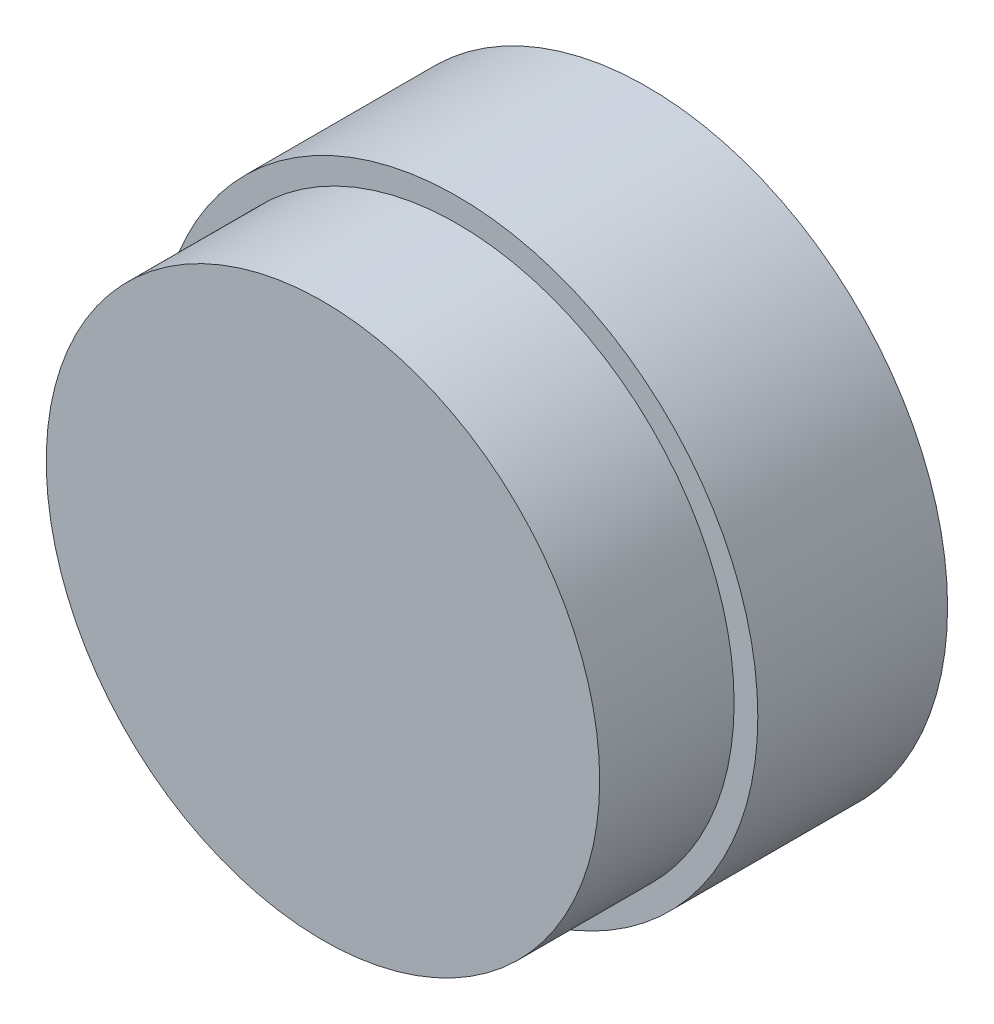
ISO-10303-21;
HEADER;
FILE_DESCRIPTION(('STEP AP214'),'2;1');
FILE_NAME('part.step','',(''),(''),'','','');
FILE_SCHEMA(('AUTOMOTIVE_DESIGN { 1 0 10303 214 1 1 1 1 }'));
ENDSEC;
DATA;
#1=APPLICATION_CONTEXT('core data for automotive mechanical design processes');
#2=APPLICATION_PROTOCOL_DEFINITION('international standard','automotive_design',2000,#1);
#3=PRODUCT_CONTEXT('',#1,'mechanical');
#4=PRODUCT('Part','Part','',(#3));
#5=PRODUCT_RELATED_PRODUCT_CATEGORY('part','',(#4));
#6=PRODUCT_DEFINITION_FORMATION('','',#4);
#7=PRODUCT_DEFINITION_CONTEXT('part definition',#1,'design');
#8=PRODUCT_DEFINITION('design','',#6,#7);
#9=PRODUCT_DEFINITION_SHAPE('','',#8);
#10=(LENGTH_UNIT() NAMED_UNIT(*) SI_UNIT(.MILLI.,.METRE.));
#11=(NAMED_UNIT(*) PLANE_ANGLE_UNIT() SI_UNIT($,.RADIAN.));
#12=(NAMED_UNIT(*) SI_UNIT($,.STERADIAN.) SOLID_ANGLE_UNIT());
#13=UNCERTAINTY_MEASURE_WITH_UNIT(LENGTH_MEASURE(1.E-05),#10,'distance_accuracy_value','');
#14=(GEOMETRIC_REPRESENTATION_CONTEXT(3) GLOBAL_UNCERTAINTY_ASSIGNED_CONTEXT((#13)) GLOBAL_UNIT_ASSIGNED_CONTEXT((#10,
#11,#12)) REPRESENTATION_CONTEXT('',''));
#15=CARTESIAN_POINT('',(0.,0.,0.));
#16=DIRECTION('',(0.,0.,1.));
#17=DIRECTION('',(1.,0.,0.));
#18=AXIS2_PLACEMENT_3D('',#15,#16,#17);
#19=CARTESIAN_POINT('',(17.677669529664,17.677669529664,11.99));
#20=DIRECTION('',(0.,0.,1.));
#21=DIRECTION('',(1.,0.,0.));
#22=AXIS2_PLACEMENT_3D('',#19,#20,#21);
#23=PLANE('',#22);
#24=CARTESIAN_POINT('',(17.677669529664,17.677669529664,11.99));
#25=DIRECTION('',(0.,0.,1.));
#26=DIRECTION('',(1.,0.,0.));
#27=AXIS2_PLACEMENT_3D('',#24,#25,#26);
#28=CIRCLE('',#27,1.);
#29=CARTESIAN_POINT('',(18.677669529664,17.677669529664,11.99));
#30=VERTEX_POINT('',#29);
#31=EDGE_CURVE('E9',#30,#30,#28,.T.);
#32=ORIENTED_EDGE('',*,*,#31,.F.);
#33=EDGE_LOOP('',(#32));
#34=FACE_BOUND('',#33,.T.);
#35=ADVANCED_FACE('F14',(#34),#23,.F.);
#36=CARTESIAN_POINT('',(-17.67766952966,17.677669529664,11.99));
#37=DIRECTION('',(0.,0.,1.));
#38=DIRECTION('',(1.,0.,0.));
#39=AXIS2_PLACEMENT_3D('',#36,#37,#38);
#40=PLANE('',#39);
#41=CARTESIAN_POINT('',(-17.67766952966,17.677669529664,11.99));
#42=DIRECTION('',(0.,0.,1.));
#43=DIRECTION('',(1.,0.,0.));
#44=AXIS2_PLACEMENT_3D('',#41,#42,#43);
#45=CIRCLE('',#44,1.);
#46=CARTESIAN_POINT('',(-16.67766952966,17.677669529664,11.99));
#47=VERTEX_POINT('',#46);
#48=EDGE_CURVE('E47',#47,#47,#45,.T.);
#49=ORIENTED_EDGE('',*,*,#48,.F.);
#50=EDGE_LOOP('',(#49));
#51=FACE_BOUND('',#50,.T.);
#52=ADVANCED_FACE('F164',(#51),#40,.F.);
#53=CARTESIAN_POINT('',(17.677669529664,-17.67766952966,11.99));
#54=DIRECTION('',(0.,0.,1.));
#55=DIRECTION('',(1.,0.,0.));
#56=AXIS2_PLACEMENT_3D('',#53,#54,#55);
#57=PLANE('',#56);
#58=CARTESIAN_POINT('',(17.677669529664,-17.67766952966,11.99));
#59=DIRECTION('',(0.,0.,1.));
#60=DIRECTION('',(1.,0.,0.));
#61=AXIS2_PLACEMENT_3D('',#58,#59,#60);
#62=CIRCLE('',#61,1.);
#63=CARTESIAN_POINT('',(18.677669529664,-17.67766952966,11.99));
#64=VERTEX_POINT('',#63);
#65=EDGE_CURVE('E118',#64,#64,#62,.T.);
#66=ORIENTED_EDGE('',*,*,#65,.F.);
#67=EDGE_LOOP('',(#66));
#68=FACE_BOUND('',#67,.T.);
#69=ADVANCED_FACE('F170',(#68),#57,.F.);
#70=CARTESIAN_POINT('',(-17.67766952966,-17.67766952966,11.99));
#71=DIRECTION('',(0.,0.,1.));
#72=DIRECTION('',(1.,0.,0.));
#73=AXIS2_PLACEMENT_3D('',#70,#71,#72);
#74=PLANE('',#73);
#75=CARTESIAN_POINT('',(-17.67766952966,-17.67766952966,11.99));
#76=DIRECTION('',(0.,0.,1.));
#77=DIRECTION('',(1.,0.,0.));
#78=AXIS2_PLACEMENT_3D('',#75,#76,#77);
#79=CIRCLE('',#78,1.);
#80=CARTESIAN_POINT('',(-16.67766952966,-17.67766952966,11.99));
#81=VERTEX_POINT('',#80);
#82=EDGE_CURVE('E112',#81,#81,#79,.T.);
#83=ORIENTED_EDGE('',*,*,#82,.F.);
#84=EDGE_LOOP('',(#83));
#85=FACE_BOUND('',#84,.T.);
#86=ADVANCED_FACE('F178',(#85),#74,.F.);
#87=CARTESIAN_POINT('',(0.,0.,41.));
#88=DIRECTION('',(0.,0.,1.));
#89=DIRECTION('',(1.,0.,0.));
#90=AXIS2_PLACEMENT_3D('',#87,#88,#89);
#91=PLANE('',#90);
#92=CARTESIAN_POINT('',(0.,0.,41.));
#93=DIRECTION('',(0.,0.,1.));
#94=DIRECTION('',(1.,0.,0.));
#95=AXIS2_PLACEMENT_3D('',#92,#93,#94);
#96=CIRCLE('',#95,35.);
#97=CARTESIAN_POINT('',(35.,0.,41.));
#98=VERTEX_POINT('',#97);
#99=EDGE_CURVE('E104',#98,#98,#96,.T.);
#100=ORIENTED_EDGE('',*,*,#99,.T.);
#101=EDGE_LOOP('',(#100));
#102=FACE_BOUND('',#101,.T.);
#103=ADVANCED_FACE('F16',(#102),#91,.T.);
#104=CARTESIAN_POINT('',(17.677669529664,17.677669529664,-0.01));
#105=DIRECTION('',(0.,0.,1.));
#106=DIRECTION('',(1.,0.,0.));
#107=AXIS2_PLACEMENT_3D('',#104,#105,#106);
#108=CYLINDRICAL_SURFACE('',#107,1.);
#109=CARTESIAN_POINT('',(17.677669529664,17.677669529664,0.));
#110=DIRECTION('',(0.,0.,1.));
#111=DIRECTION('',(1.,0.,0.));
#112=AXIS2_PLACEMENT_3D('',#109,#110,#111);
#113=CIRCLE('',#112,1.);
#114=CARTESIAN_POINT('',(18.677669529664,17.677669529664,0.));
#115=VERTEX_POINT('',#114);
#116=EDGE_CURVE('E131',#115,#115,#113,.T.);
#117=ORIENTED_EDGE('',*,*,#116,.F.);
#118=DIRECTION('',(0.,0.,1.));
#119=VECTOR('',#118,1.);
#120=CARTESIAN_POINT('',(18.677669529664,17.677669529664,-0.01));
#121=LINE('',#120,#119);
#122=EDGE_CURVE('E24',#115,#30,#121,.T.);
#123=ORIENTED_EDGE('',*,*,#122,.T.);
#124=ORIENTED_EDGE('',*,*,#31,.T.);
#125=ORIENTED_EDGE('',*,*,#122,.F.);
#126=EDGE_LOOP('',(#117,#123,#124,#125));
#127=FACE_BOUND('',#126,.T.);
#128=ADVANCED_FACE('F174',(#127),#108,.F.);
#129=CARTESIAN_POINT('',(-17.67766952966,17.677669529664,-0.01));
#130=DIRECTION('',(0.,0.,1.));
#131=DIRECTION('',(1.,0.,0.));
#132=AXIS2_PLACEMENT_3D('',#129,#130,#131);
#133=CYLINDRICAL_SURFACE('',#132,1.);
#134=CARTESIAN_POINT('',(-17.67766952966,17.677669529664,0.));
#135=DIRECTION('',(0.,0.,1.));
#136=DIRECTION('',(1.,0.,0.));
#137=AXIS2_PLACEMENT_3D('',#134,#135,#136);
#138=CIRCLE('',#137,1.);
#139=CARTESIAN_POINT('',(-16.67766952966,17.677669529664,0.));
#140=VERTEX_POINT('',#139);
#141=EDGE_CURVE('E128',#140,#140,#138,.T.);
#142=ORIENTED_EDGE('',*,*,#141,.F.);
#143=DIRECTION('',(0.,0.,1.));
#144=VECTOR('',#143,1.);
#145=CARTESIAN_POINT('',(-16.67766952966,17.677669529664,-0.01));
#146=LINE('',#145,#144);
#147=EDGE_CURVE('E115',#140,#47,#146,.T.);
#148=ORIENTED_EDGE('',*,*,#147,.T.);
#149=ORIENTED_EDGE('',*,*,#48,.T.);
#150=ORIENTED_EDGE('',*,*,#147,.F.);
#151=EDGE_LOOP('',(#142,#148,#149,#150));
#152=FACE_BOUND('',#151,.T.);
#153=ADVANCED_FACE('F177',(#152),#133,.F.);
#154=CARTESIAN_POINT('',(17.677669529664,-17.67766952966,-0.01));
#155=DIRECTION('',(0.,0.,1.));
#156=DIRECTION('',(1.,0.,0.));
#157=AXIS2_PLACEMENT_3D('',#154,#155,#156);
#158=CYLINDRICAL_SURFACE('',#157,1.);
#159=CARTESIAN_POINT('',(17.677669529664,-17.67766952966,0.));
#160=DIRECTION('',(0.,0.,1.));
#161=DIRECTION('',(1.,0.,0.));
#162=AXIS2_PLACEMENT_3D('',#159,#160,#161);
#163=CIRCLE('',#162,1.);
#164=CARTESIAN_POINT('',(18.677669529664,-17.67766952966,0.));
#165=VERTEX_POINT('',#164);
#166=EDGE_CURVE('E132',#165,#165,#163,.T.);
#167=ORIENTED_EDGE('',*,*,#166,.F.);
#168=DIRECTION('',(0.,0.,1.));
#169=VECTOR('',#168,1.);
#170=CARTESIAN_POINT('',(18.677669529664,-17.67766952966,-0.01));
#171=LINE('',#170,#169);
#172=EDGE_CURVE('E18',#165,#64,#171,.T.);
#173=ORIENTED_EDGE('',*,*,#172,.T.);
#174=ORIENTED_EDGE('',*,*,#65,.T.);
#175=ORIENTED_EDGE('',*,*,#172,.F.);
#176=EDGE_LOOP('',(#167,#173,#174,#175));
#177=FACE_BOUND('',#176,.T.);
#178=ADVANCED_FACE('F207',(#177),#158,.F.);
#179=CARTESIAN_POINT('',(-17.67766952966,-17.67766952966,-0.01));
#180=DIRECTION('',(0.,0.,1.));
#181=DIRECTION('',(1.,0.,0.));
#182=AXIS2_PLACEMENT_3D('',#179,#180,#181);
#183=CYLINDRICAL_SURFACE('',#182,1.);
#184=CARTESIAN_POINT('',(-17.67766952966,-17.67766952966,0.));
#185=DIRECTION('',(0.,0.,1.));
#186=DIRECTION('',(1.,0.,0.));
#187=AXIS2_PLACEMENT_3D('',#184,#185,#186);
#188=CIRCLE('',#187,1.);
#189=CARTESIAN_POINT('',(-16.67766952966,-17.67766952966,0.));
#190=VERTEX_POINT('',#189);
#191=EDGE_CURVE('E98',#190,#190,#188,.T.);
#192=ORIENTED_EDGE('',*,*,#191,.F.);
#193=DIRECTION('',(0.,0.,1.));
#194=VECTOR('',#193,1.);
#195=CARTESIAN_POINT('',(-16.67766952966,-17.67766952966,-0.01));
#196=LINE('',#195,#194);
#197=EDGE_CURVE('E110',#190,#81,#196,.T.);
#198=ORIENTED_EDGE('',*,*,#197,.T.);
#199=ORIENTED_EDGE('',*,*,#82,.T.);
#200=ORIENTED_EDGE('',*,*,#197,.F.);
#201=EDGE_LOOP('',(#192,#198,#199,#200));
#202=FACE_BOUND('',#201,.T.);
#203=ADVANCED_FACE('F190',(#202),#183,.F.);
#204=CARTESIAN_POINT('',(0.,0.,24.));
#205=DIRECTION('',(0.,0.,1.));
#206=DIRECTION('',(1.,0.,0.));
#207=AXIS2_PLACEMENT_3D('',#204,#205,#206);
#208=CYLINDRICAL_SURFACE('',#207,35.);
#209=ORIENTED_EDGE('',*,*,#99,.F.);
#210=DIRECTION('',(0.,0.,1.));
#211=VECTOR('',#210,1.);
#212=CARTESIAN_POINT('',(35.,0.,24.));
#213=LINE('',#212,#211);
#214=CARTESIAN_POINT('',(35.,0.,24.));
#215=VERTEX_POINT('',#214);
#216=EDGE_CURVE('E108',#215,#98,#213,.T.);
#217=ORIENTED_EDGE('',*,*,#216,.F.);
#218=CARTESIAN_POINT('',(0.,0.,24.));
#219=DIRECTION('',(0.,0.,1.));
#220=DIRECTION('',(1.,0.,0.));
#221=AXIS2_PLACEMENT_3D('',#218,#219,#220);
#222=CIRCLE('',#221,35.);
#223=EDGE_CURVE('E90',#215,#215,#222,.T.);
#224=ORIENTED_EDGE('',*,*,#223,.T.);
#225=ORIENTED_EDGE('',*,*,#216,.T.);
#226=EDGE_LOOP('',(#209,#217,#224,#225));
#227=FACE_BOUND('',#226,.T.);
#228=ADVANCED_FACE('F146',(#227),#208,.T.);
#229=CARTESIAN_POINT('',(0.,0.,0.));
#230=DIRECTION('',(0.,0.,1.));
#231=DIRECTION('',(1.,0.,0.));
#232=AXIS2_PLACEMENT_3D('',#229,#230,#231);
#233=PLANE('',#232);
#234=ORIENTED_EDGE('',*,*,#116,.T.);
#235=EDGE_LOOP('',(#234));
#236=FACE_BOUND('',#235,.T.);
#237=ORIENTED_EDGE('',*,*,#141,.T.);
#238=EDGE_LOOP('',(#237));
#239=FACE_BOUND('',#238,.T.);
#240=ORIENTED_EDGE('',*,*,#166,.T.);
#241=EDGE_LOOP('',(#240));
#242=FACE_BOUND('',#241,.T.);
#243=ORIENTED_EDGE('',*,*,#191,.T.);
#244=EDGE_LOOP('',(#243));
#245=FACE_BOUND('',#244,.T.);
#246=CARTESIAN_POINT('',(0.,0.,0.));
#247=DIRECTION('',(0.,0.,1.));
#248=DIRECTION('',(1.,0.,0.));
#249=AXIS2_PLACEMENT_3D('',#246,#247,#248);
#250=CIRCLE('',#249,38.);
#251=CARTESIAN_POINT('',(38.,0.,0.));
#252=VERTEX_POINT('',#251);
#253=EDGE_CURVE('E83',#252,#252,#250,.T.);
#254=ORIENTED_EDGE('',*,*,#253,.F.);
#255=EDGE_LOOP('',(#254));
#256=FACE_BOUND('',#255,.T.);
#257=ADVANCED_FACE('F152',(#236,#239,#242,#245,#256),#233,.F.);
#258=CARTESIAN_POINT('',(0.,0.,24.));
#259=DIRECTION('',(0.,0.,1.));
#260=DIRECTION('',(1.,0.,0.));
#261=AXIS2_PLACEMENT_3D('',#258,#259,#260);
#262=PLANE('',#261);
#263=ORIENTED_EDGE('',*,*,#223,.F.);
#264=EDGE_LOOP('',(#263));
#265=FACE_BOUND('',#264,.T.);
#266=CARTESIAN_POINT('',(0.,0.,24.));
#267=DIRECTION('',(0.,0.,1.));
#268=DIRECTION('',(1.,0.,0.));
#269=AXIS2_PLACEMENT_3D('',#266,#267,#268);
#270=CIRCLE('',#269,38.);
#271=CARTESIAN_POINT('',(38.,0.,24.));
#272=VERTEX_POINT('',#271);
#273=EDGE_CURVE('E100',#272,#272,#270,.T.);
#274=ORIENTED_EDGE('',*,*,#273,.T.);
#275=EDGE_LOOP('',(#274));
#276=FACE_BOUND('',#275,.T.);
#277=ADVANCED_FACE('F149',(#265,#276),#262,.T.);
#278=CARTESIAN_POINT('',(0.,0.,0.));
#279=DIRECTION('',(0.,0.,1.));
#280=DIRECTION('',(1.,0.,0.));
#281=AXIS2_PLACEMENT_3D('',#278,#279,#280);
#282=CYLINDRICAL_SURFACE('',#281,38.);
#283=ORIENTED_EDGE('',*,*,#273,.F.);
#284=DIRECTION('',(0.,0.,1.));
#285=VECTOR('',#284,1.);
#286=CARTESIAN_POINT('',(38.,0.,0.));
#287=LINE('',#286,#285);
#288=EDGE_CURVE('E86',#252,#272,#287,.T.);
#289=ORIENTED_EDGE('',*,*,#288,.F.);
#290=ORIENTED_EDGE('',*,*,#253,.T.);
#291=ORIENTED_EDGE('',*,*,#288,.T.);
#292=EDGE_LOOP('',(#283,#289,#290,#291));
#293=FACE_BOUND('',#292,.T.);
#294=ADVANCED_FACE('F85',(#293),#282,.T.);
#295=CLOSED_SHELL('',(#35,#52,#69,#86,#103,#128,#153,#178,#203,#228,#257,#277,#294));
#296=MANIFOLD_SOLID_BREP('B1',#295);
#297=ADVANCED_BREP_SHAPE_REPRESENTATION('',(#18,#296),#14);
#298=SHAPE_DEFINITION_REPRESENTATION(#9,#297);
ENDSEC;
END-ISO-10303-21;
